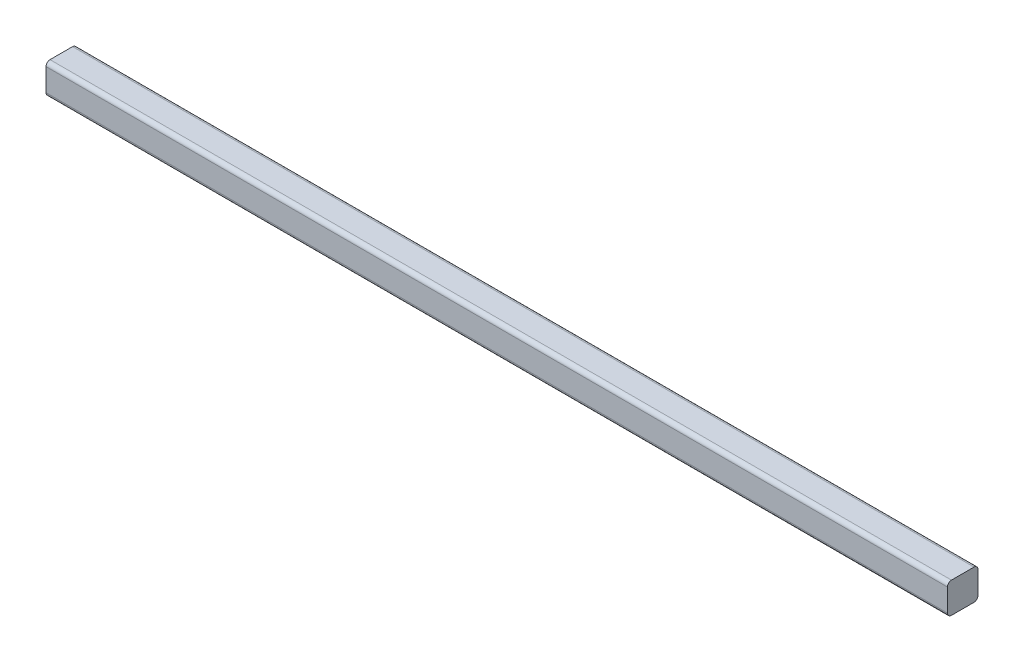
ISO-10303-21;
HEADER;
FILE_DESCRIPTION(('STEP AP214'),'2;1');
FILE_NAME('part.step','',(''),(''),'','','');
FILE_SCHEMA(('AUTOMOTIVE_DESIGN { 1 0 10303 214 1 1 1 1 }'));
ENDSEC;
DATA;
#1=APPLICATION_CONTEXT('core data for automotive mechanical design processes');
#2=APPLICATION_PROTOCOL_DEFINITION('international standard','automotive_design',2000,#1);
#3=PRODUCT_CONTEXT('',#1,'mechanical');
#4=PRODUCT('Part','Part','',(#3));
#5=PRODUCT_RELATED_PRODUCT_CATEGORY('part','',(#4));
#6=PRODUCT_DEFINITION_FORMATION('','',#4);
#7=PRODUCT_DEFINITION_CONTEXT('part definition',#1,'design');
#8=PRODUCT_DEFINITION('design','',#6,#7);
#9=PRODUCT_DEFINITION_SHAPE('','',#8);
#10=(LENGTH_UNIT() NAMED_UNIT(*) SI_UNIT(.MILLI.,.METRE.));
#11=(NAMED_UNIT(*) PLANE_ANGLE_UNIT() SI_UNIT($,.RADIAN.));
#12=(NAMED_UNIT(*) SI_UNIT($,.STERADIAN.) SOLID_ANGLE_UNIT());
#13=UNCERTAINTY_MEASURE_WITH_UNIT(LENGTH_MEASURE(1.E-05),#10,'distance_accuracy_value','');
#14=(GEOMETRIC_REPRESENTATION_CONTEXT(3) GLOBAL_UNCERTAINTY_ASSIGNED_CONTEXT((#13)) GLOBAL_UNIT_ASSIGNED_CONTEXT((#10,
#11,#12)) REPRESENTATION_CONTEXT('',''));
#15=CARTESIAN_POINT('',(0.,0.,0.));
#16=DIRECTION('',(0.,0.,1.));
#17=DIRECTION('',(1.,0.,0.));
#18=AXIS2_PLACEMENT_3D('',#15,#16,#17);
#19=CARTESIAN_POINT('',(561.975,-19.05,-19.05));
#20=DIRECTION('',(0.,0.,1.));
#21=DIRECTION('',(1.,0.,0.));
#22=AXIS2_PLACEMENT_3D('',#19,#20,#21);
#23=PLANE('',#22);
#24=DIRECTION('',(0.,1.,0.));
#25=VECTOR('',#24,1.);
#26=CARTESIAN_POINT('',(561.975,-19.05,-19.05));
#27=LINE('',#26,#25);
#28=CARTESIAN_POINT('',(561.975,-14.05,-19.05));
#29=VERTEX_POINT('',#28);
#30=CARTESIAN_POINT('',(561.975,14.05,-19.05));
#31=VERTEX_POINT('',#30);
#32=EDGE_CURVE('E133',#29,#31,#27,.T.);
#33=ORIENTED_EDGE('',*,*,#32,.F.);
#34=DIRECTION('',(-1.,0.,0.));
#35=VECTOR('',#34,1.);
#36=CARTESIAN_POINT('',(561.975,-14.05,-19.05));
#37=LINE('',#36,#35);
#38=CARTESIAN_POINT('',(-561.975,-14.05,-19.05));
#39=VERTEX_POINT('',#38);
#40=EDGE_CURVE('E11',#29,#39,#37,.T.);
#41=ORIENTED_EDGE('',*,*,#40,.T.);
#42=DIRECTION('',(0.,1.,0.));
#43=VECTOR('',#42,1.);
#44=CARTESIAN_POINT('',(-561.975,-19.05,-19.05));
#45=LINE('',#44,#43);
#46=CARTESIAN_POINT('',(-561.975,14.05,-19.05));
#47=VERTEX_POINT('',#46);
#48=EDGE_CURVE('E164',#39,#47,#45,.T.);
#49=ORIENTED_EDGE('',*,*,#48,.T.);
#50=DIRECTION('',(-1.,0.,0.));
#51=VECTOR('',#50,1.);
#52=CARTESIAN_POINT('',(561.975,14.05,-19.05));
#53=LINE('',#52,#51);
#54=EDGE_CURVE('E47',#47,#31,#53,.F.);
#55=ORIENTED_EDGE('',*,*,#54,.T.);
#56=EDGE_LOOP('',(#33,#41,#49,#55));
#57=FACE_BOUND('',#56,.T.);
#58=ADVANCED_FACE('F39',(#57),#23,.F.);
#59=CARTESIAN_POINT('',(561.975,19.05,19.05));
#60=DIRECTION('',(0.,-1.,0.));
#61=DIRECTION('',(0.,0.,-1.));
#62=AXIS2_PLACEMENT_3D('',#59,#60,#61);
#63=PLANE('',#62);
#64=DIRECTION('',(0.,0.,1.));
#65=VECTOR('',#64,1.);
#66=CARTESIAN_POINT('',(-561.975,19.05,19.05));
#67=LINE('',#66,#65);
#68=CARTESIAN_POINT('',(-561.975,19.05,-14.05));
#69=VERTEX_POINT('',#68);
#70=CARTESIAN_POINT('',(-561.975,19.05,14.05));
#71=VERTEX_POINT('',#70);
#72=EDGE_CURVE('E138',#69,#71,#67,.T.);
#73=ORIENTED_EDGE('',*,*,#72,.T.);
#74=DIRECTION('',(-1.,0.,0.));
#75=VECTOR('',#74,1.);
#76=CARTESIAN_POINT('',(561.975,19.05,14.05));
#77=LINE('',#76,#75);
#78=CARTESIAN_POINT('',(561.975,19.05,14.05));
#79=VERTEX_POINT('',#78);
#80=EDGE_CURVE('E54',#71,#79,#77,.F.);
#81=ORIENTED_EDGE('',*,*,#80,.T.);
#82=DIRECTION('',(0.,0.,1.));
#83=VECTOR('',#82,1.);
#84=CARTESIAN_POINT('',(561.975,19.05,19.05));
#85=LINE('',#84,#83);
#86=CARTESIAN_POINT('',(561.975,19.05,-14.05));
#87=VERTEX_POINT('',#86);
#88=EDGE_CURVE('E136',#87,#79,#85,.T.);
#89=ORIENTED_EDGE('',*,*,#88,.F.);
#90=DIRECTION('',(-1.,0.,0.));
#91=VECTOR('',#90,1.);
#92=CARTESIAN_POINT('',(561.975,19.05,-14.05));
#93=LINE('',#92,#91);
#94=EDGE_CURVE('E156',#87,#69,#93,.T.);
#95=ORIENTED_EDGE('',*,*,#94,.T.);
#96=EDGE_LOOP('',(#73,#81,#89,#95));
#97=FACE_BOUND('',#96,.T.);
#98=ADVANCED_FACE('F171',(#97),#63,.F.);
#99=CARTESIAN_POINT('',(561.975,-19.05,19.05));
#100=DIRECTION('',(0.,0.,-1.));
#101=DIRECTION('',(-1.,0.,0.));
#102=AXIS2_PLACEMENT_3D('',#99,#100,#101);
#103=PLANE('',#102);
#104=DIRECTION('',(0.,-1.,0.));
#105=VECTOR('',#104,1.);
#106=CARTESIAN_POINT('',(-561.975,-19.05,19.05));
#107=LINE('',#106,#105);
#108=CARTESIAN_POINT('',(-561.975,14.05,19.05));
#109=VERTEX_POINT('',#108);
#110=CARTESIAN_POINT('',(-561.975,-14.05,19.05));
#111=VERTEX_POINT('',#110);
#112=EDGE_CURVE('E134',#109,#111,#107,.T.);
#113=ORIENTED_EDGE('',*,*,#112,.T.);
#114=DIRECTION('',(-1.,0.,0.));
#115=VECTOR('',#114,1.);
#116=CARTESIAN_POINT('',(561.975,-14.05,19.05));
#117=LINE('',#116,#115);
#118=CARTESIAN_POINT('',(561.975,-14.05,19.05));
#119=VERTEX_POINT('',#118);
#120=EDGE_CURVE('E111',#111,#119,#117,.F.);
#121=ORIENTED_EDGE('',*,*,#120,.T.);
#122=DIRECTION('',(0.,-1.,0.));
#123=VECTOR('',#122,1.);
#124=CARTESIAN_POINT('',(561.975,-19.05,19.05));
#125=LINE('',#124,#123);
#126=CARTESIAN_POINT('',(561.975,14.05,19.05));
#127=VERTEX_POINT('',#126);
#128=EDGE_CURVE('E175',#127,#119,#125,.T.);
#129=ORIENTED_EDGE('',*,*,#128,.F.);
#130=DIRECTION('',(-1.,0.,0.));
#131=VECTOR('',#130,1.);
#132=CARTESIAN_POINT('',(561.975,14.05,19.05));
#133=LINE('',#132,#131);
#134=EDGE_CURVE('E116',#127,#109,#133,.T.);
#135=ORIENTED_EDGE('',*,*,#134,.T.);
#136=EDGE_LOOP('',(#113,#121,#129,#135));
#137=FACE_BOUND('',#136,.T.);
#138=ADVANCED_FACE('F183',(#137),#103,.F.);
#139=CARTESIAN_POINT('',(561.975,-19.05,19.05));
#140=DIRECTION('',(0.,1.,0.));
#141=DIRECTION('',(0.,0.,1.));
#142=AXIS2_PLACEMENT_3D('',#139,#140,#141);
#143=PLANE('',#142);
#144=DIRECTION('',(0.,0.,-1.));
#145=VECTOR('',#144,1.);
#146=CARTESIAN_POINT('',(561.975,-19.05,19.05));
#147=LINE('',#146,#145);
#148=CARTESIAN_POINT('',(561.975,-19.05,14.05));
#149=VERTEX_POINT('',#148);
#150=CARTESIAN_POINT('',(561.975,-19.05,-14.05));
#151=VERTEX_POINT('',#150);
#152=EDGE_CURVE('E126',#149,#151,#147,.T.);
#153=ORIENTED_EDGE('',*,*,#152,.F.);
#154=DIRECTION('',(-1.,0.,0.));
#155=VECTOR('',#154,1.);
#156=CARTESIAN_POINT('',(561.975,-19.05,14.05));
#157=LINE('',#156,#155);
#158=CARTESIAN_POINT('',(-561.975,-19.05,14.05));
#159=VERTEX_POINT('',#158);
#160=EDGE_CURVE('E110',#149,#159,#157,.T.);
#161=ORIENTED_EDGE('',*,*,#160,.T.);
#162=DIRECTION('',(0.,0.,-1.));
#163=VECTOR('',#162,1.);
#164=CARTESIAN_POINT('',(-561.975,-19.05,19.05));
#165=LINE('',#164,#163);
#166=CARTESIAN_POINT('',(-561.975,-19.05,-14.05));
#167=VERTEX_POINT('',#166);
#168=EDGE_CURVE('E123',#159,#167,#165,.T.);
#169=ORIENTED_EDGE('',*,*,#168,.T.);
#170=DIRECTION('',(-1.,0.,0.));
#171=VECTOR('',#170,1.);
#172=CARTESIAN_POINT('',(561.975,-19.05,-14.05));
#173=LINE('',#172,#171);
#174=EDGE_CURVE('E128',#167,#151,#173,.F.);
#175=ORIENTED_EDGE('',*,*,#174,.T.);
#176=EDGE_LOOP('',(#153,#161,#169,#175));
#177=FACE_BOUND('',#176,.T.);
#178=ADVANCED_FACE('F122',(#177),#143,.F.);
#179=CARTESIAN_POINT('',(561.975,0.,0.));
#180=DIRECTION('',(-1.,0.,0.));
#181=DIRECTION('',(0.,0.,1.));
#182=AXIS2_PLACEMENT_3D('',#179,#180,#181);
#183=PLANE('',#182);
#184=ORIENTED_EDGE('',*,*,#128,.T.);
#185=CARTESIAN_POINT('',(561.975,-14.05,14.05));
#186=DIRECTION('',(-1.,0.,0.));
#187=DIRECTION('',(0.,0.,1.));
#188=AXIS2_PLACEMENT_3D('',#185,#186,#187);
#189=CIRCLE('',#188,5.);
#190=EDGE_CURVE('E154',#119,#149,#189,.F.);
#191=ORIENTED_EDGE('',*,*,#190,.T.);
#192=ORIENTED_EDGE('',*,*,#152,.T.);
#193=CARTESIAN_POINT('',(561.975,-14.05,-14.05));
#194=DIRECTION('',(-1.,0.,0.));
#195=DIRECTION('',(0.,0.,1.));
#196=AXIS2_PLACEMENT_3D('',#193,#194,#195);
#197=CIRCLE('',#196,5.);
#198=EDGE_CURVE('E150',#151,#29,#197,.F.);
#199=ORIENTED_EDGE('',*,*,#198,.T.);
#200=ORIENTED_EDGE('',*,*,#32,.T.);
#201=CARTESIAN_POINT('',(561.975,14.05,-14.05));
#202=DIRECTION('',(-1.,0.,0.));
#203=DIRECTION('',(0.,0.,1.));
#204=AXIS2_PLACEMENT_3D('',#201,#202,#203);
#205=CIRCLE('',#204,5.);
#206=EDGE_CURVE('E61',#31,#87,#205,.F.);
#207=ORIENTED_EDGE('',*,*,#206,.T.);
#208=ORIENTED_EDGE('',*,*,#88,.T.);
#209=CARTESIAN_POINT('',(561.975,14.05,14.05));
#210=DIRECTION('',(-1.,0.,0.));
#211=DIRECTION('',(0.,0.,1.));
#212=AXIS2_PLACEMENT_3D('',#209,#210,#211);
#213=CIRCLE('',#212,5.);
#214=EDGE_CURVE('E152',#79,#127,#213,.F.);
#215=ORIENTED_EDGE('',*,*,#214,.T.);
#216=EDGE_LOOP('',(#184,#191,#192,#199,#200,#207,#208,#215));
#217=FACE_BOUND('',#216,.T.);
#218=ADVANCED_FACE('F167',(#217),#183,.F.);
#219=CARTESIAN_POINT('',(-561.975,0.,0.));
#220=DIRECTION('',(-1.,0.,0.));
#221=DIRECTION('',(0.,0.,1.));
#222=AXIS2_PLACEMENT_3D('',#219,#220,#221);
#223=PLANE('',#222);
#224=ORIENTED_EDGE('',*,*,#168,.F.);
#225=CARTESIAN_POINT('',(-561.975,-14.05,14.05));
#226=DIRECTION('',(-1.,0.,0.));
#227=DIRECTION('',(0.,0.,1.));
#228=AXIS2_PLACEMENT_3D('',#225,#226,#227);
#229=CIRCLE('',#228,5.);
#230=EDGE_CURVE('E106',#159,#111,#229,.T.);
#231=ORIENTED_EDGE('',*,*,#230,.T.);
#232=ORIENTED_EDGE('',*,*,#112,.F.);
#233=CARTESIAN_POINT('',(-561.975,14.05,14.05));
#234=DIRECTION('',(-1.,0.,0.));
#235=DIRECTION('',(0.,0.,1.));
#236=AXIS2_PLACEMENT_3D('',#233,#234,#235);
#237=CIRCLE('',#236,5.);
#238=EDGE_CURVE('E117',#109,#71,#237,.T.);
#239=ORIENTED_EDGE('',*,*,#238,.T.);
#240=ORIENTED_EDGE('',*,*,#72,.F.);
#241=CARTESIAN_POINT('',(-561.975,14.05,-14.05));
#242=DIRECTION('',(-1.,0.,0.));
#243=DIRECTION('',(0.,0.,1.));
#244=AXIS2_PLACEMENT_3D('',#241,#242,#243);
#245=CIRCLE('',#244,5.);
#246=EDGE_CURVE('E127',#69,#47,#245,.T.);
#247=ORIENTED_EDGE('',*,*,#246,.T.);
#248=ORIENTED_EDGE('',*,*,#48,.F.);
#249=CARTESIAN_POINT('',(-561.975,-14.05,-14.05));
#250=DIRECTION('',(-1.,0.,0.));
#251=DIRECTION('',(0.,0.,1.));
#252=AXIS2_PLACEMENT_3D('',#249,#250,#251);
#253=CIRCLE('',#252,5.);
#254=EDGE_CURVE('E132',#39,#167,#253,.T.);
#255=ORIENTED_EDGE('',*,*,#254,.T.);
#256=EDGE_LOOP('',(#224,#231,#232,#239,#240,#247,#248,#255));
#257=FACE_BOUND('',#256,.T.);
#258=ADVANCED_FACE('F130',(#257),#223,.T.);
#259=CARTESIAN_POINT('',(561.975,-14.05,14.05));
#260=DIRECTION('',(-1.,0.,0.));
#261=DIRECTION('',(0.,0.,1.));
#262=AXIS2_PLACEMENT_3D('',#259,#260,#261);
#263=CYLINDRICAL_SURFACE('',#262,5.);
#264=ORIENTED_EDGE('',*,*,#190,.F.);
#265=ORIENTED_EDGE('',*,*,#120,.F.);
#266=ORIENTED_EDGE('',*,*,#230,.F.);
#267=ORIENTED_EDGE('',*,*,#160,.F.);
#268=EDGE_LOOP('',(#264,#265,#266,#267));
#269=FACE_BOUND('',#268,.T.);
#270=ADVANCED_FACE('F109',(#269),#263,.T.);
#271=CARTESIAN_POINT('',(561.975,14.05,14.05));
#272=DIRECTION('',(-1.,0.,0.));
#273=DIRECTION('',(0.,0.,1.));
#274=AXIS2_PLACEMENT_3D('',#271,#272,#273);
#275=CYLINDRICAL_SURFACE('',#274,5.);
#276=ORIENTED_EDGE('',*,*,#214,.F.);
#277=ORIENTED_EDGE('',*,*,#80,.F.);
#278=ORIENTED_EDGE('',*,*,#238,.F.);
#279=ORIENTED_EDGE('',*,*,#134,.F.);
#280=EDGE_LOOP('',(#276,#277,#278,#279));
#281=FACE_BOUND('',#280,.T.);
#282=ADVANCED_FACE('F181',(#281),#275,.T.);
#283=CARTESIAN_POINT('',(561.975,-14.05,-14.05));
#284=DIRECTION('',(-1.,0.,0.));
#285=DIRECTION('',(0.,0.,1.));
#286=AXIS2_PLACEMENT_3D('',#283,#284,#285);
#287=CYLINDRICAL_SURFACE('',#286,5.);
#288=ORIENTED_EDGE('',*,*,#198,.F.);
#289=ORIENTED_EDGE('',*,*,#174,.F.);
#290=ORIENTED_EDGE('',*,*,#254,.F.);
#291=ORIENTED_EDGE('',*,*,#40,.F.);
#292=EDGE_LOOP('',(#288,#289,#290,#291));
#293=FACE_BOUND('',#292,.T.);
#294=ADVANCED_FACE('F185',(#293),#287,.T.);
#295=CARTESIAN_POINT('',(561.975,14.05,-14.05));
#296=DIRECTION('',(-1.,0.,0.));
#297=DIRECTION('',(0.,0.,1.));
#298=AXIS2_PLACEMENT_3D('',#295,#296,#297);
#299=CYLINDRICAL_SURFACE('',#298,5.);
#300=ORIENTED_EDGE('',*,*,#206,.F.);
#301=ORIENTED_EDGE('',*,*,#54,.F.);
#302=ORIENTED_EDGE('',*,*,#246,.F.);
#303=ORIENTED_EDGE('',*,*,#94,.F.);
#304=EDGE_LOOP('',(#300,#301,#302,#303));
#305=FACE_BOUND('',#304,.T.);
#306=ADVANCED_FACE('F41',(#305),#299,.T.);
#307=CLOSED_SHELL('',(#58,#98,#138,#178,#218,#258,#270,#282,#294,#306));
#308=MANIFOLD_SOLID_BREP('B2',#307);
#309=ADVANCED_BREP_SHAPE_REPRESENTATION('',(#18,#308),#14);
#310=SHAPE_DEFINITION_REPRESENTATION(#9,#309);
ENDSEC;
END-ISO-10303-21;
